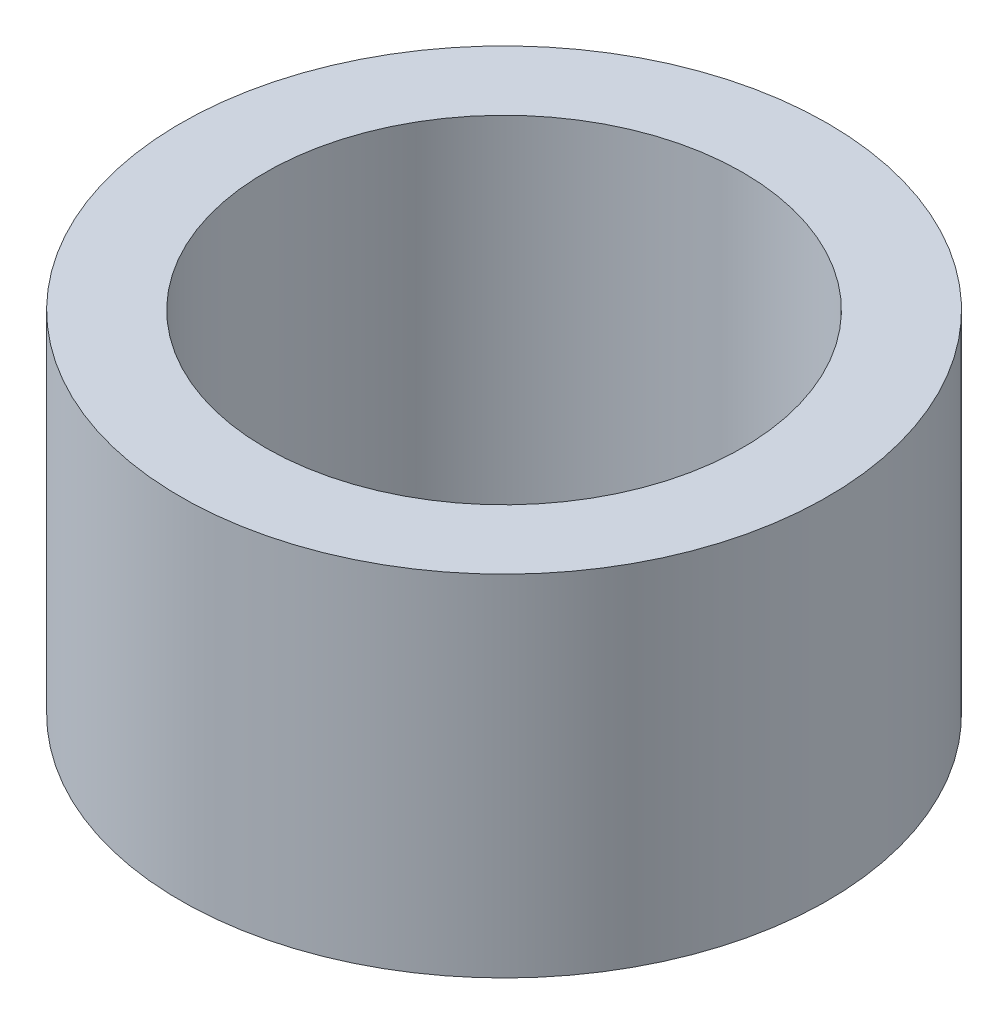
ISO-10303-21;
HEADER;
FILE_DESCRIPTION(('STEP AP214'),'2;1');
FILE_NAME('part.step','',(''),(''),'','','');
FILE_SCHEMA(('AUTOMOTIVE_DESIGN { 1 0 10303 214 1 1 1 1 }'));
ENDSEC;
DATA;
#1=APPLICATION_CONTEXT('core data for automotive mechanical design processes');
#2=APPLICATION_PROTOCOL_DEFINITION('international standard','automotive_design',2000,#1);
#3=PRODUCT_CONTEXT('',#1,'mechanical');
#4=PRODUCT('Part','Part','',(#3));
#5=PRODUCT_RELATED_PRODUCT_CATEGORY('part','',(#4));
#6=PRODUCT_DEFINITION_FORMATION('','',#4);
#7=PRODUCT_DEFINITION_CONTEXT('part definition',#1,'design');
#8=PRODUCT_DEFINITION('design','',#6,#7);
#9=PRODUCT_DEFINITION_SHAPE('','',#8);
#10=(LENGTH_UNIT() NAMED_UNIT(*) SI_UNIT(.MILLI.,.METRE.));
#11=(NAMED_UNIT(*) PLANE_ANGLE_UNIT() SI_UNIT($,.RADIAN.));
#12=(NAMED_UNIT(*) SI_UNIT($,.STERADIAN.) SOLID_ANGLE_UNIT());
#13=UNCERTAINTY_MEASURE_WITH_UNIT(LENGTH_MEASURE(1.E-05),#10,'distance_accuracy_value','');
#14=(GEOMETRIC_REPRESENTATION_CONTEXT(3) GLOBAL_UNCERTAINTY_ASSIGNED_CONTEXT((#13)) GLOBAL_UNIT_ASSIGNED_CONTEXT((#10,
#11,#12)) REPRESENTATION_CONTEXT('',''));
#15=CARTESIAN_POINT('',(0.,0.,0.));
#16=DIRECTION('',(0.,0.,1.));
#17=DIRECTION('',(1.,0.,0.));
#18=AXIS2_PLACEMENT_3D('',#15,#16,#17);
#19=CARTESIAN_POINT('',(0.,0.,0.));
#20=DIRECTION('',(0.,1.,0.));
#21=DIRECTION('',(0.,0.,1.));
#22=AXIS2_PLACEMENT_3D('',#19,#20,#21);
#23=CYLINDRICAL_SURFACE('',#22,6.5786);
#24=CARTESIAN_POINT('',(0.,0.,0.));
#25=DIRECTION('',(0.,1.,0.));
#26=DIRECTION('',(0.,0.,-1.));
#27=AXIS2_PLACEMENT_3D('',#24,#25,#26);
#28=CIRCLE('',#27,6.5786);
#29=CARTESIAN_POINT('',(0.,0.,-6.5786));
#30=VERTEX_POINT('',#29);
#31=EDGE_CURVE('E10',#30,#30,#28,.T.);
#32=ORIENTED_EDGE('',*,*,#31,.T.);
#33=EDGE_LOOP('',(#32));
#34=FACE_BOUND('',#33,.T.);
#35=CARTESIAN_POINT('',(0.,7.112,0.));
#36=DIRECTION('',(0.,1.,0.));
#37=DIRECTION('',(0.,0.,-1.));
#38=AXIS2_PLACEMENT_3D('',#35,#36,#37);
#39=CIRCLE('',#38,6.5786);
#40=CARTESIAN_POINT('',(0.,7.112,-6.5786));
#41=VERTEX_POINT('',#40);
#42=EDGE_CURVE('E33',#41,#41,#39,.T.);
#43=ORIENTED_EDGE('',*,*,#42,.F.);
#44=EDGE_LOOP('',(#43));
#45=FACE_BOUND('',#44,.T.);
#46=ADVANCED_FACE('F30',(#34,#45),#23,.T.);
#47=CARTESIAN_POINT('',(0.,0.,0.));
#48=DIRECTION('',(0.,-1.,0.));
#49=DIRECTION('',(0.,0.,-1.));
#50=AXIS2_PLACEMENT_3D('',#47,#48,#49);
#51=PLANE('',#50);
#52=CARTESIAN_POINT('',(0.,0.,0.));
#53=DIRECTION('',(0.,1.,0.));
#54=DIRECTION('',(0.,0.,-1.));
#55=AXIS2_PLACEMENT_3D('',#52,#53,#54);
#56=CIRCLE('',#55,4.8514);
#57=CARTESIAN_POINT('',(0.,0.,-4.8514));
#58=VERTEX_POINT('',#57);
#59=EDGE_CURVE('E40',#58,#58,#56,.T.);
#60=ORIENTED_EDGE('',*,*,#59,.T.);
#61=EDGE_LOOP('',(#60));
#62=FACE_BOUND('',#61,.T.);
#63=ORIENTED_EDGE('',*,*,#31,.F.);
#64=EDGE_LOOP('',(#63));
#65=FACE_BOUND('',#64,.T.);
#66=ADVANCED_FACE('F48',(#62,#65),#51,.T.);
#67=CARTESIAN_POINT('',(0.,7.112,0.));
#68=DIRECTION('',(0.,-1.,0.));
#69=DIRECTION('',(0.,0.,-1.));
#70=AXIS2_PLACEMENT_3D('',#67,#68,#69);
#71=PLANE('',#70);
#72=CARTESIAN_POINT('',(0.,7.112,0.));
#73=DIRECTION('',(0.,1.,0.));
#74=DIRECTION('',(0.,0.,-1.));
#75=AXIS2_PLACEMENT_3D('',#72,#73,#74);
#76=CIRCLE('',#75,4.8514);
#77=CARTESIAN_POINT('',(0.,7.112,-4.8514));
#78=VERTEX_POINT('',#77);
#79=EDGE_CURVE('E42',#78,#78,#76,.T.);
#80=ORIENTED_EDGE('',*,*,#79,.F.);
#81=EDGE_LOOP('',(#80));
#82=FACE_BOUND('',#81,.T.);
#83=ORIENTED_EDGE('',*,*,#42,.T.);
#84=EDGE_LOOP('',(#83));
#85=FACE_BOUND('',#84,.T.);
#86=ADVANCED_FACE('F54',(#82,#85),#71,.F.);
#87=CARTESIAN_POINT('',(0.,0.,0.));
#88=DIRECTION('',(0.,1.,0.));
#89=DIRECTION('',(0.,0.,1.));
#90=AXIS2_PLACEMENT_3D('',#87,#88,#89);
#91=CYLINDRICAL_SURFACE('',#90,4.8514);
#92=ORIENTED_EDGE('',*,*,#59,.F.);
#93=EDGE_LOOP('',(#92));
#94=FACE_BOUND('',#93,.T.);
#95=ORIENTED_EDGE('',*,*,#79,.T.);
#96=EDGE_LOOP('',(#95));
#97=FACE_BOUND('',#96,.T.);
#98=ADVANCED_FACE('F51',(#94,#97),#91,.F.);
#99=CLOSED_SHELL('',(#46,#66,#86,#98));
#100=MANIFOLD_SOLID_BREP('B2',#99);
#101=ADVANCED_BREP_SHAPE_REPRESENTATION('',(#18,#100),#14);
#102=SHAPE_DEFINITION_REPRESENTATION(#9,#101);
ENDSEC;
END-ISO-10303-21;
